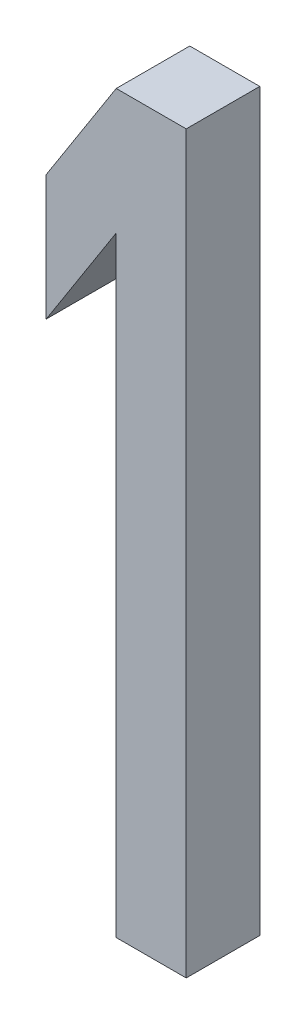
ISO-10303-21;
HEADER;
FILE_DESCRIPTION(('STEP AP214'),'2;1');
FILE_NAME('part.step','',(''),(''),'','','');
FILE_SCHEMA(('AUTOMOTIVE_DESIGN { 1 0 10303 214 1 1 1 1 }'));
ENDSEC;
DATA;
#1=APPLICATION_CONTEXT('core data for automotive mechanical design processes');
#2=APPLICATION_PROTOCOL_DEFINITION('international standard','automotive_design',2000,#1);
#3=PRODUCT_CONTEXT('',#1,'mechanical');
#4=PRODUCT('Part','Part','',(#3));
#5=PRODUCT_RELATED_PRODUCT_CATEGORY('part','',(#4));
#6=PRODUCT_DEFINITION_FORMATION('','',#4);
#7=PRODUCT_DEFINITION_CONTEXT('part definition',#1,'design');
#8=PRODUCT_DEFINITION('design','',#6,#7);
#9=PRODUCT_DEFINITION_SHAPE('','',#8);
#10=(LENGTH_UNIT() NAMED_UNIT(*) SI_UNIT(.MILLI.,.METRE.));
#11=(NAMED_UNIT(*) PLANE_ANGLE_UNIT() SI_UNIT($,.RADIAN.));
#12=(NAMED_UNIT(*) SI_UNIT($,.STERADIAN.) SOLID_ANGLE_UNIT());
#13=UNCERTAINTY_MEASURE_WITH_UNIT(LENGTH_MEASURE(1.E-05),#10,'distance_accuracy_value','');
#14=(GEOMETRIC_REPRESENTATION_CONTEXT(3) GLOBAL_UNCERTAINTY_ASSIGNED_CONTEXT((#13)) GLOBAL_UNIT_ASSIGNED_CONTEXT((#10,
#11,#12)) REPRESENTATION_CONTEXT('',''));
#15=CARTESIAN_POINT('',(0.,0.,0.));
#16=DIRECTION('',(0.,0.,1.));
#17=DIRECTION('',(1.,0.,0.));
#18=AXIS2_PLACEMENT_3D('',#15,#16,#17);
#19=CARTESIAN_POINT('',(-1.04461879526,-0.712240098159247,-20.));
#20=DIRECTION('',(0.,0.,1.));
#21=DIRECTION('',(1.,0.,0.));
#22=AXIS2_PLACEMENT_3D('',#19,#20,#21);
#23=PLANE('',#22);
#24=DIRECTION('',(0.,1.,0.));
#25=VECTOR('',#24,1.);
#26=CARTESIAN_POINT('',(-23.11931818182,-0.85,-20.));
#27=LINE('',#26,#25);
#28=CARTESIAN_POINT('',(-23.11931818182,-0.85,-20.));
#29=VERTEX_POINT('',#28);
#30=CARTESIAN_POINT('',(-23.11931818182,1.15,-20.));
#31=VERTEX_POINT('',#30);
#32=EDGE_CURVE('E11',#29,#31,#27,.T.);
#33=ORIENTED_EDGE('',*,*,#32,.F.);
#34=DIRECTION('',(1.,0.,0.));
#35=VECTOR('',#34,1.);
#36=CARTESIAN_POINT('',(-23.30965909091,-0.85,-20.));
#37=LINE('',#36,#35);
#38=CARTESIAN_POINT('',(-23.30965909091,-0.85,-20.));
#39=VERTEX_POINT('',#38);
#40=EDGE_CURVE('E24',#39,#29,#37,.T.);
#41=ORIENTED_EDGE('',*,*,#40,.F.);
#42=DIRECTION('',(0.,-1.,0.));
#43=VECTOR('',#42,1.);
#44=CARTESIAN_POINT('',(-23.30965909091,0.809574508667,-20.));
#45=LINE('',#44,#43);
#46=CARTESIAN_POINT('',(-23.30965909091,0.809574508667,-20.));
#47=VERTEX_POINT('',#46);
#48=EDGE_CURVE('E93',#47,#39,#45,.T.);
#49=ORIENTED_EDGE('',*,*,#48,.F.);
#50=DIRECTION('',(0.538456628166712,0.842653226175118,0.));
#51=VECTOR('',#50,1.);
#52=CARTESIAN_POINT('',(-23.5,0.5117020845413,-20.));
#53=LINE('',#52,#51);
#54=CARTESIAN_POINT('',(-23.5,0.5117020845413,-20.));
#55=VERTEX_POINT('',#54);
#56=EDGE_CURVE('E120',#55,#47,#53,.T.);
#57=ORIENTED_EDGE('',*,*,#56,.F.);
#58=DIRECTION('',(0.,-1.,0.));
#59=VECTOR('',#58,1.);
#60=CARTESIAN_POINT('',(-23.5,0.8521276950836,-20.));
#61=LINE('',#60,#59);
#62=CARTESIAN_POINT('',(-23.5,0.8521276950836,-20.));
#63=VERTEX_POINT('',#62);
#64=EDGE_CURVE('E117',#63,#55,#61,.T.);
#65=ORIENTED_EDGE('',*,*,#64,.F.);
#66=DIRECTION('',(-0.538456781179807,-0.84265312839951,0.));
#67=VECTOR('',#66,1.);
#68=CARTESIAN_POINT('',(-23.30965909091,1.15,-20.));
#69=LINE('',#68,#67);
#70=CARTESIAN_POINT('',(-23.30965909091,1.15,-20.));
#71=VERTEX_POINT('',#70);
#72=EDGE_CURVE('E114',#71,#63,#69,.T.);
#73=ORIENTED_EDGE('',*,*,#72,.F.);
#74=DIRECTION('',(-1.,0.,0.));
#75=VECTOR('',#74,1.);
#76=CARTESIAN_POINT('',(-23.11931818182,1.15,-20.));
#77=LINE('',#76,#75);
#78=EDGE_CURVE('E111',#31,#71,#77,.T.);
#79=ORIENTED_EDGE('',*,*,#78,.F.);
#80=EDGE_LOOP('',(#33,#41,#49,#57,#65,#73,#79));
#81=FACE_BOUND('',#80,.T.);
#82=ADVANCED_FACE('F17',(#81),#23,.F.);
#83=CARTESIAN_POINT('',(0.,0.,-19.8));
#84=DIRECTION('',(0.,0.,1.));
#85=DIRECTION('',(1.,0.,0.));
#86=AXIS2_PLACEMENT_3D('',#83,#84,#85);
#87=PLANE('',#86);
#88=DIRECTION('',(0.,1.,0.));
#89=VECTOR('',#88,1.);
#90=CARTESIAN_POINT('',(-23.11931818182,-0.85,-19.8));
#91=LINE('',#90,#89);
#92=CARTESIAN_POINT('',(-23.11931818182,-0.85,-19.8));
#93=VERTEX_POINT('',#92);
#94=CARTESIAN_POINT('',(-23.11931818182,1.15,-19.8));
#95=VERTEX_POINT('',#94);
#96=EDGE_CURVE('E109',#93,#95,#91,.T.);
#97=ORIENTED_EDGE('',*,*,#96,.T.);
#98=DIRECTION('',(-1.,0.,0.));
#99=VECTOR('',#98,1.);
#100=CARTESIAN_POINT('',(-23.11931818182,1.15,-19.8));
#101=LINE('',#100,#99);
#102=CARTESIAN_POINT('',(-23.30965909091,1.15,-19.8));
#103=VERTEX_POINT('',#102);
#104=EDGE_CURVE('E107',#95,#103,#101,.T.);
#105=ORIENTED_EDGE('',*,*,#104,.T.);
#106=DIRECTION('',(-0.538456781179807,-0.84265312839951,0.));
#107=VECTOR('',#106,1.);
#108=CARTESIAN_POINT('',(-23.30965909091,1.15,-19.8));
#109=LINE('',#108,#107);
#110=CARTESIAN_POINT('',(-23.5,0.8521276950836,-19.8));
#111=VERTEX_POINT('',#110);
#112=EDGE_CURVE('E105',#103,#111,#109,.T.);
#113=ORIENTED_EDGE('',*,*,#112,.T.);
#114=DIRECTION('',(0.,-1.,0.));
#115=VECTOR('',#114,1.);
#116=CARTESIAN_POINT('',(-23.5,0.8521276950836,-19.8));
#117=LINE('',#116,#115);
#118=CARTESIAN_POINT('',(-23.5,0.5117020845413,-19.8));
#119=VERTEX_POINT('',#118);
#120=EDGE_CURVE('E103',#111,#119,#117,.T.);
#121=ORIENTED_EDGE('',*,*,#120,.T.);
#122=DIRECTION('',(0.538456628166712,0.842653226175118,0.));
#123=VECTOR('',#122,1.);
#124=CARTESIAN_POINT('',(-23.5,0.5117020845413,-19.8));
#125=LINE('',#124,#123);
#126=CARTESIAN_POINT('',(-23.30965909091,0.809574508667,-19.8));
#127=VERTEX_POINT('',#126);
#128=EDGE_CURVE('E78',#119,#127,#125,.T.);
#129=ORIENTED_EDGE('',*,*,#128,.T.);
#130=DIRECTION('',(0.,-1.,0.));
#131=VECTOR('',#130,1.);
#132=CARTESIAN_POINT('',(-23.30965909091,0.809574508667,-19.8));
#133=LINE('',#132,#131);
#134=CARTESIAN_POINT('',(-23.30965909091,-0.85,-19.8));
#135=VERTEX_POINT('',#134);
#136=EDGE_CURVE('E72',#127,#135,#133,.T.);
#137=ORIENTED_EDGE('',*,*,#136,.T.);
#138=DIRECTION('',(1.,0.,0.));
#139=VECTOR('',#138,1.);
#140=CARTESIAN_POINT('',(-23.30965909091,-0.85,-19.8));
#141=LINE('',#140,#139);
#142=EDGE_CURVE('E75',#135,#93,#141,.T.);
#143=ORIENTED_EDGE('',*,*,#142,.T.);
#144=EDGE_LOOP('',(#97,#105,#113,#121,#129,#137,#143));
#145=FACE_BOUND('',#144,.T.);
#146=ADVANCED_FACE('F74',(#145),#87,.T.);
#147=CARTESIAN_POINT('',(-23.11931818182,-0.85,-20.));
#148=DIRECTION('',(1.,0.,0.));
#149=DIRECTION('',(0.,1.,0.));
#150=AXIS2_PLACEMENT_3D('',#147,#148,#149);
#151=PLANE('',#150);
#152=ORIENTED_EDGE('',*,*,#32,.T.);
#153=DIRECTION('',(0.,0.,1.));
#154=VECTOR('',#153,1.);
#155=CARTESIAN_POINT('',(-23.11931818182,1.15,-20.));
#156=LINE('',#155,#154);
#157=EDGE_CURVE('E89',#31,#95,#156,.T.);
#158=ORIENTED_EDGE('',*,*,#157,.T.);
#159=ORIENTED_EDGE('',*,*,#96,.F.);
#160=DIRECTION('',(0.,0.,1.));
#161=VECTOR('',#160,1.);
#162=CARTESIAN_POINT('',(-23.11931818182,-0.85,-20.));
#163=LINE('',#162,#161);
#164=EDGE_CURVE('E88',#29,#93,#163,.T.);
#165=ORIENTED_EDGE('',*,*,#164,.F.);
#166=EDGE_LOOP('',(#152,#158,#159,#165));
#167=FACE_BOUND('',#166,.T.);
#168=ADVANCED_FACE('F123',(#167),#151,.T.);
#169=CARTESIAN_POINT('',(-23.30965909091,-0.85,-20.));
#170=DIRECTION('',(0.,-1.,0.));
#171=DIRECTION('',(1.,0.,0.));
#172=AXIS2_PLACEMENT_3D('',#169,#170,#171);
#173=PLANE('',#172);
#174=ORIENTED_EDGE('',*,*,#40,.T.);
#175=ORIENTED_EDGE('',*,*,#164,.T.);
#176=ORIENTED_EDGE('',*,*,#142,.F.);
#177=DIRECTION('',(0.,0.,1.));
#178=VECTOR('',#177,1.);
#179=CARTESIAN_POINT('',(-23.30965909091,-0.85,-20.));
#180=LINE('',#179,#178);
#181=EDGE_CURVE('E87',#39,#135,#180,.T.);
#182=ORIENTED_EDGE('',*,*,#181,.F.);
#183=EDGE_LOOP('',(#174,#175,#176,#182));
#184=FACE_BOUND('',#183,.T.);
#185=ADVANCED_FACE('F86',(#184),#173,.T.);
#186=CARTESIAN_POINT('',(-23.30965909091,0.809574508667,-20.));
#187=DIRECTION('',(-1.,0.,0.));
#188=DIRECTION('',(0.,-1.,0.));
#189=AXIS2_PLACEMENT_3D('',#186,#187,#188);
#190=PLANE('',#189);
#191=ORIENTED_EDGE('',*,*,#48,.T.);
#192=ORIENTED_EDGE('',*,*,#181,.T.);
#193=ORIENTED_EDGE('',*,*,#136,.F.);
#194=DIRECTION('',(0.,0.,1.));
#195=VECTOR('',#194,1.);
#196=CARTESIAN_POINT('',(-23.30965909091,0.809574508667,-20.));
#197=LINE('',#196,#195);
#198=EDGE_CURVE('E94',#47,#127,#197,.T.);
#199=ORIENTED_EDGE('',*,*,#198,.F.);
#200=EDGE_LOOP('',(#191,#192,#193,#199));
#201=FACE_BOUND('',#200,.T.);
#202=ADVANCED_FACE('F92',(#201),#190,.T.);
#203=CARTESIAN_POINT('',(-23.5,0.5117020845413,-20.));
#204=DIRECTION('',(0.842653226175119,-0.538456628166712,0.));
#205=DIRECTION('',(0.538456628166712,0.842653226175119,0.));
#206=AXIS2_PLACEMENT_3D('',#203,#204,#205);
#207=PLANE('',#206);
#208=ORIENTED_EDGE('',*,*,#56,.T.);
#209=ORIENTED_EDGE('',*,*,#198,.T.);
#210=ORIENTED_EDGE('',*,*,#128,.F.);
#211=DIRECTION('',(0.,0.,1.));
#212=VECTOR('',#211,1.);
#213=CARTESIAN_POINT('',(-23.5,0.5117020845413,-20.));
#214=LINE('',#213,#212);
#215=EDGE_CURVE('E97',#55,#119,#214,.T.);
#216=ORIENTED_EDGE('',*,*,#215,.F.);
#217=EDGE_LOOP('',(#208,#209,#210,#216));
#218=FACE_BOUND('',#217,.T.);
#219=ADVANCED_FACE('F144',(#218),#207,.T.);
#220=CARTESIAN_POINT('',(-23.5,0.8521276950836,-20.));
#221=DIRECTION('',(-1.,0.,0.));
#222=DIRECTION('',(0.,-1.,0.));
#223=AXIS2_PLACEMENT_3D('',#220,#221,#222);
#224=PLANE('',#223);
#225=ORIENTED_EDGE('',*,*,#64,.T.);
#226=ORIENTED_EDGE('',*,*,#215,.T.);
#227=ORIENTED_EDGE('',*,*,#120,.F.);
#228=DIRECTION('',(0.,0.,1.));
#229=VECTOR('',#228,1.);
#230=CARTESIAN_POINT('',(-23.5,0.8521276950836,-20.));
#231=LINE('',#230,#229);
#232=EDGE_CURVE('E133',#63,#111,#231,.T.);
#233=ORIENTED_EDGE('',*,*,#232,.F.);
#234=EDGE_LOOP('',(#225,#226,#227,#233));
#235=FACE_BOUND('',#234,.T.);
#236=ADVANCED_FACE('F141',(#235),#224,.T.);
#237=CARTESIAN_POINT('',(-23.30965909091,1.15,-20.));
#238=DIRECTION('',(-0.84265312839951,0.538456781179807,0.));
#239=DIRECTION('',(-0.538456781179807,-0.84265312839951,0.));
#240=AXIS2_PLACEMENT_3D('',#237,#238,#239);
#241=PLANE('',#240);
#242=ORIENTED_EDGE('',*,*,#72,.T.);
#243=ORIENTED_EDGE('',*,*,#232,.T.);
#244=ORIENTED_EDGE('',*,*,#112,.F.);
#245=DIRECTION('',(0.,0.,1.));
#246=VECTOR('',#245,1.);
#247=CARTESIAN_POINT('',(-23.30965909091,1.15,-20.));
#248=LINE('',#247,#246);
#249=EDGE_CURVE('E131',#71,#103,#248,.T.);
#250=ORIENTED_EDGE('',*,*,#249,.F.);
#251=EDGE_LOOP('',(#242,#243,#244,#250));
#252=FACE_BOUND('',#251,.T.);
#253=ADVANCED_FACE('F145',(#252),#241,.T.);
#254=CARTESIAN_POINT('',(-23.11931818182,1.15,-20.));
#255=DIRECTION('',(0.,1.,0.));
#256=DIRECTION('',(-1.,0.,0.));
#257=AXIS2_PLACEMENT_3D('',#254,#255,#256);
#258=PLANE('',#257);
#259=ORIENTED_EDGE('',*,*,#78,.T.);
#260=ORIENTED_EDGE('',*,*,#249,.T.);
#261=ORIENTED_EDGE('',*,*,#104,.F.);
#262=ORIENTED_EDGE('',*,*,#157,.F.);
#263=EDGE_LOOP('',(#259,#260,#261,#262));
#264=FACE_BOUND('',#263,.T.);
#265=ADVANCED_FACE('F129',(#264),#258,.T.);
#266=CLOSED_SHELL('',(#82,#146,#168,#185,#202,#219,#236,#253,#265));
#267=MANIFOLD_SOLID_BREP('B1',#266);
#268=ADVANCED_BREP_SHAPE_REPRESENTATION('',(#18,#267),#14);
#269=SHAPE_DEFINITION_REPRESENTATION(#9,#268);
ENDSEC;
END-ISO-10303-21;
